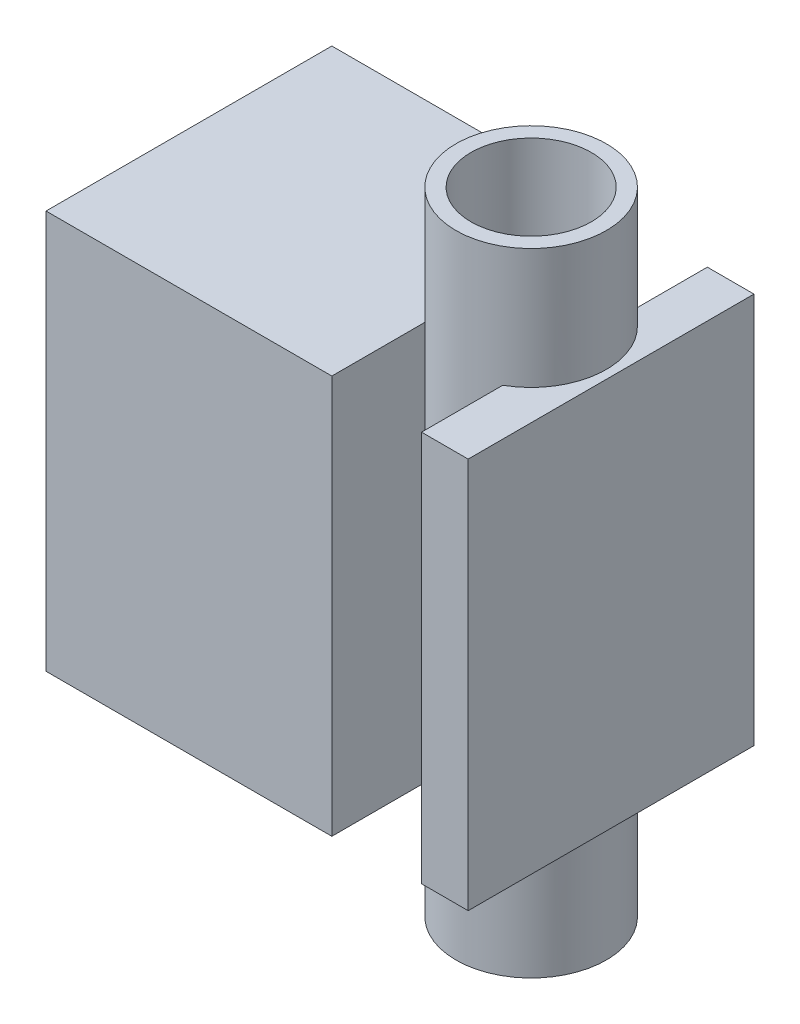
ISO-10303-21;
HEADER;
FILE_DESCRIPTION(('STEP AP214'),'2;1');
FILE_NAME('part.step','',(''),(''),'','','');
FILE_SCHEMA(('AUTOMOTIVE_DESIGN { 1 0 10303 214 1 1 1 1 }'));
ENDSEC;
DATA;
#1=APPLICATION_CONTEXT('core data for automotive mechanical design processes');
#2=APPLICATION_PROTOCOL_DEFINITION('international standard','automotive_design',2000,#1);
#3=PRODUCT_CONTEXT('',#1,'mechanical');
#4=PRODUCT('Part','Part','',(#3));
#5=PRODUCT_RELATED_PRODUCT_CATEGORY('part','',(#4));
#6=PRODUCT_DEFINITION_FORMATION('','',#4);
#7=PRODUCT_DEFINITION_CONTEXT('part definition',#1,'design');
#8=PRODUCT_DEFINITION('design','',#6,#7);
#9=PRODUCT_DEFINITION_SHAPE('','',#8);
#10=(LENGTH_UNIT() NAMED_UNIT(*) SI_UNIT(.MILLI.,.METRE.));
#11=(NAMED_UNIT(*) PLANE_ANGLE_UNIT() SI_UNIT($,.RADIAN.));
#12=(NAMED_UNIT(*) SI_UNIT($,.STERADIAN.) SOLID_ANGLE_UNIT());
#13=UNCERTAINTY_MEASURE_WITH_UNIT(LENGTH_MEASURE(1.E-05),#10,'distance_accuracy_value','');
#14=(GEOMETRIC_REPRESENTATION_CONTEXT(3) GLOBAL_UNCERTAINTY_ASSIGNED_CONTEXT((#13)) GLOBAL_UNIT_ASSIGNED_CONTEXT((#10,
#11,#12)) REPRESENTATION_CONTEXT('',''));
#15=CARTESIAN_POINT('',(0.,0.,0.));
#16=DIRECTION('',(0.,0.,1.));
#17=DIRECTION('',(1.,0.,0.));
#18=AXIS2_PLACEMENT_3D('',#15,#16,#17);
#19=CARTESIAN_POINT('',(-62.7768595041322,-38.9338842975206,18.5));
#20=DIRECTION('',(0.,1.,0.));
#21=DIRECTION('',(0.,0.,1.));
#22=AXIS2_PLACEMENT_3D('',#19,#20,#21);
#23=CYLINDRICAL_SURFACE('',#22,10.);
#24=CARTESIAN_POINT('',(-62.7768595041322,29.5661157024794,18.5));
#25=DIRECTION('',(0.,-1.,0.));
#26=DIRECTION('',(0.,0.,-1.));
#27=AXIS2_PLACEMENT_3D('',#24,#25,#26);
#28=CIRCLE('',#27,10.);
#29=CARTESIAN_POINT('',(-69.7768595041322,29.5661157024794,25.6414284285429));
#30=VERTEX_POINT('',#29);
#31=CARTESIAN_POINT('',(-69.7768595041322,29.5661157024794,11.3585715714572));
#32=VERTEX_POINT('',#31);
#33=EDGE_CURVE('E11',#30,#32,#28,.T.);
#34=ORIENTED_EDGE('',*,*,#33,.F.);
#35=DIRECTION('',(0.,1.,0.));
#36=VECTOR('',#35,1.);
#37=CARTESIAN_POINT('',(-69.7768595041322,-38.9338842975206,25.6414284285429));
#38=LINE('',#37,#36);
#39=CARTESIAN_POINT('',(-69.7768595041322,-23.4338842975206,25.6414284285429));
#40=VERTEX_POINT('',#39);
#41=EDGE_CURVE('E182',#40,#30,#38,.T.);
#42=ORIENTED_EDGE('',*,*,#41,.F.);
#43=CARTESIAN_POINT('',(-62.7768595041322,-23.4338842975206,18.5));
#44=DIRECTION('',(0.,1.,0.));
#45=DIRECTION('',(0.,0.,1.));
#46=AXIS2_PLACEMENT_3D('',#43,#44,#45);
#47=CIRCLE('',#46,10.);
#48=CARTESIAN_POINT('',(-69.7768595041322,-23.4338842975206,11.3585715714572));
#49=VERTEX_POINT('',#48);
#50=EDGE_CURVE('E198',#49,#40,#47,.T.);
#51=ORIENTED_EDGE('',*,*,#50,.F.);
#52=DIRECTION('',(0.,1.,0.));
#53=VECTOR('',#52,1.);
#54=CARTESIAN_POINT('',(-69.7768595041322,-38.9338842975206,11.3585715714572));
#55=LINE('',#54,#53);
#56=EDGE_CURVE('E184',#49,#32,#55,.T.);
#57=ORIENTED_EDGE('',*,*,#56,.T.);
#58=EDGE_LOOP('',(#34,#42,#51,#57));
#59=FACE_BOUND('',#58,.T.);
#60=CARTESIAN_POINT('',(-62.7768595041322,-38.9338842975206,18.5));
#61=DIRECTION('',(0.,1.,0.));
#62=DIRECTION('',(0.,0.,1.));
#63=AXIS2_PLACEMENT_3D('',#60,#61,#62);
#64=CIRCLE('',#63,10.);
#65=CARTESIAN_POINT('',(-62.7768595041322,-38.9338842975206,28.5));
#66=VERTEX_POINT('',#65);
#67=EDGE_CURVE('E195',#66,#66,#64,.T.);
#68=ORIENTED_EDGE('',*,*,#67,.T.);
#69=EDGE_LOOP('',(#68));
#70=FACE_BOUND('',#69,.T.);
#71=CARTESIAN_POINT('',(-62.7768595041322,45.0661157024794,18.5));
#72=DIRECTION('',(0.,1.,0.));
#73=DIRECTION('',(0.,0.,1.));
#74=AXIS2_PLACEMENT_3D('',#71,#72,#73);
#75=CIRCLE('',#74,10.);
#76=CARTESIAN_POINT('',(-62.7768595041322,45.0661157024794,28.5));
#77=VERTEX_POINT('',#76);
#78=EDGE_CURVE('E39',#77,#77,#75,.T.);
#79=ORIENTED_EDGE('',*,*,#78,.F.);
#80=EDGE_LOOP('',(#79));
#81=FACE_BOUND('',#80,.T.);
#82=DIRECTION('',(0.,1.,0.));
#83=VECTOR('',#82,1.);
#84=CARTESIAN_POINT('',(-57.8500113922823,-38.9338842975206,9.79792164579283));
#85=LINE('',#84,#83);
#86=CARTESIAN_POINT('',(-57.8500113922823,-22.9338842975206,9.79792164579283));
#87=VERTEX_POINT('',#86);
#88=CARTESIAN_POINT('',(-57.8500113922823,29.0661157024794,9.79792164579283));
#89=VERTEX_POINT('',#88);
#90=EDGE_CURVE('E57',#87,#89,#85,.T.);
#91=ORIENTED_EDGE('',*,*,#90,.F.);
#92=CARTESIAN_POINT('',(-62.7768595041322,-22.9338842975206,18.5));
#93=DIRECTION('',(0.,1.,0.));
#94=DIRECTION('',(0.,0.,1.));
#95=AXIS2_PLACEMENT_3D('',#92,#93,#94);
#96=CIRCLE('',#95,10.);
#97=CARTESIAN_POINT('',(-57.8500113922823,-22.9338842975206,27.2020783542072));
#98=VERTEX_POINT('',#97);
#99=EDGE_CURVE('E52',#87,#98,#96,.F.);
#100=ORIENTED_EDGE('',*,*,#99,.T.);
#101=DIRECTION('',(0.,1.,0.));
#102=VECTOR('',#101,1.);
#103=CARTESIAN_POINT('',(-57.8500113922823,-38.9338842975206,27.2020783542072));
#104=LINE('',#103,#102);
#105=CARTESIAN_POINT('',(-57.8500113922823,29.0661157024794,27.2020783542072));
#106=VERTEX_POINT('',#105);
#107=EDGE_CURVE('E175',#106,#98,#104,.F.);
#108=ORIENTED_EDGE('',*,*,#107,.F.);
#109=CARTESIAN_POINT('',(-62.7768595041322,29.0661157024794,18.5));
#110=DIRECTION('',(0.,1.,0.));
#111=DIRECTION('',(0.,0.,1.));
#112=AXIS2_PLACEMENT_3D('',#109,#110,#111);
#113=CIRCLE('',#112,10.);
#114=EDGE_CURVE('E166',#89,#106,#113,.F.);
#115=ORIENTED_EDGE('',*,*,#114,.F.);
#116=EDGE_LOOP('',(#91,#100,#108,#115));
#117=FACE_BOUND('',#116,.T.);
#118=ADVANCED_FACE('F35',(#59,#70,#81,#117),#23,.T.);
#119=CARTESIAN_POINT('',(-107.776859504132,29.5661157024794,38.));
#120=DIRECTION('',(1.,0.,0.));
#121=DIRECTION('',(0.,1.,0.));
#122=AXIS2_PLACEMENT_3D('',#119,#120,#121);
#123=PLANE('',#122);
#124=DIRECTION('',(0.,-1.,0.));
#125=VECTOR('',#124,1.);
#126=CARTESIAN_POINT('',(-107.776859504132,29.5661157024794,0.));
#127=LINE('',#126,#125);
#128=CARTESIAN_POINT('',(-107.776859504132,29.5661157024794,0.));
#129=VERTEX_POINT('',#128);
#130=CARTESIAN_POINT('',(-107.776859504132,-23.4338842975206,0.));
#131=VERTEX_POINT('',#130);
#132=EDGE_CURVE('E201',#129,#131,#127,.T.);
#133=ORIENTED_EDGE('',*,*,#132,.T.);
#134=DIRECTION('',(0.,0.,-1.));
#135=VECTOR('',#134,1.);
#136=CARTESIAN_POINT('',(-107.776859504132,-23.4338842975206,38.));
#137=LINE('',#136,#135);
#138=CARTESIAN_POINT('',(-107.776859504132,-23.4338842975206,38.));
#139=VERTEX_POINT('',#138);
#140=EDGE_CURVE('E44',#139,#131,#137,.T.);
#141=ORIENTED_EDGE('',*,*,#140,.F.);
#142=DIRECTION('',(0.,-1.,0.));
#143=VECTOR('',#142,1.);
#144=CARTESIAN_POINT('',(-107.776859504132,29.5661157024794,38.));
#145=LINE('',#144,#143);
#146=CARTESIAN_POINT('',(-107.776859504132,29.5661157024794,38.));
#147=VERTEX_POINT('',#146);
#148=EDGE_CURVE('E202',#147,#139,#145,.T.);
#149=ORIENTED_EDGE('',*,*,#148,.F.);
#150=DIRECTION('',(0.,0.,-1.));
#151=VECTOR('',#150,1.);
#152=CARTESIAN_POINT('',(-107.776859504132,29.5661157024794,38.));
#153=LINE('',#152,#151);
#154=EDGE_CURVE('E211',#147,#129,#153,.T.);
#155=ORIENTED_EDGE('',*,*,#154,.T.);
#156=EDGE_LOOP('',(#133,#141,#149,#155));
#157=FACE_BOUND('',#156,.T.);
#158=ADVANCED_FACE('F37',(#157),#123,.F.);
#159=CARTESIAN_POINT('',(-107.776859504132,-23.4338842975206,38.));
#160=DIRECTION('',(0.,1.,0.));
#161=DIRECTION('',(0.,0.,1.));
#162=AXIS2_PLACEMENT_3D('',#159,#160,#161);
#163=PLANE('',#162);
#164=DIRECTION('',(0.,0.,-1.));
#165=VECTOR('',#164,1.);
#166=CARTESIAN_POINT('',(-69.7768595041322,-23.4338842975206,38.));
#167=LINE('',#166,#165);
#168=CARTESIAN_POINT('',(-69.7768595041322,-23.4338842975206,0.));
#169=VERTEX_POINT('',#168);
#170=EDGE_CURVE('E224',#49,#169,#167,.T.);
#171=ORIENTED_EDGE('',*,*,#170,.F.);
#172=ORIENTED_EDGE('',*,*,#50,.T.);
#173=CARTESIAN_POINT('',(-69.7768595041322,-23.4338842975206,38.));
#174=VERTEX_POINT('',#173);
#175=EDGE_CURVE('E225',#174,#40,#167,.T.);
#176=ORIENTED_EDGE('',*,*,#175,.F.);
#177=DIRECTION('',(1.,0.,0.));
#178=VECTOR('',#177,1.);
#179=CARTESIAN_POINT('',(-107.776859504132,-23.4338842975206,38.));
#180=LINE('',#179,#178);
#181=EDGE_CURVE('E205',#139,#174,#180,.T.);
#182=ORIENTED_EDGE('',*,*,#181,.F.);
#183=ORIENTED_EDGE('',*,*,#140,.T.);
#184=DIRECTION('',(1.,0.,0.));
#185=VECTOR('',#184,1.);
#186=CARTESIAN_POINT('',(-107.776859504132,-23.4338842975206,0.));
#187=LINE('',#186,#185);
#188=EDGE_CURVE('E214',#131,#169,#187,.T.);
#189=ORIENTED_EDGE('',*,*,#188,.T.);
#190=EDGE_LOOP('',(#171,#172,#176,#182,#183,#189));
#191=FACE_BOUND('',#190,.T.);
#192=ADVANCED_FACE('F242',(#191),#163,.F.);
#193=CARTESIAN_POINT('',(-49.7768595041322,-38.9338842975206,38.));
#194=DIRECTION('',(0.,1.,0.));
#195=DIRECTION('',(0.,0.,1.));
#196=AXIS2_PLACEMENT_3D('',#193,#194,#195);
#197=PLANE('',#196);
#198=CARTESIAN_POINT('',(-62.7768595041322,-38.9338842975206,18.5));
#199=DIRECTION('',(0.,1.,0.));
#200=DIRECTION('',(0.,0.,1.));
#201=AXIS2_PLACEMENT_3D('',#198,#199,#200);
#202=CIRCLE('',#201,8.);
#203=CARTESIAN_POINT('',(-62.7768595041322,-38.9338842975206,26.5));
#204=VERTEX_POINT('',#203);
#205=EDGE_CURVE('E181',#204,#204,#202,.T.);
#206=ORIENTED_EDGE('',*,*,#205,.T.);
#207=EDGE_LOOP('',(#206));
#208=FACE_BOUND('',#207,.T.);
#209=ORIENTED_EDGE('',*,*,#67,.F.);
#210=EDGE_LOOP('',(#209));
#211=FACE_BOUND('',#210,.T.);
#212=ADVANCED_FACE('F264',(#208,#211),#197,.F.);
#213=CARTESIAN_POINT('',(-49.7768595041322,45.0661157024794,38.));
#214=DIRECTION('',(0.,-1.,0.));
#215=DIRECTION('',(0.,0.,-1.));
#216=AXIS2_PLACEMENT_3D('',#213,#214,#215);
#217=PLANE('',#216);
#218=CARTESIAN_POINT('',(-62.7768595041322,45.0661157024794,18.5));
#219=DIRECTION('',(0.,-1.,0.));
#220=DIRECTION('',(0.,0.,-1.));
#221=AXIS2_PLACEMENT_3D('',#218,#219,#220);
#222=CIRCLE('',#221,8.);
#223=CARTESIAN_POINT('',(-62.7768595041322,45.0661157024794,26.5));
#224=VERTEX_POINT('',#223);
#225=EDGE_CURVE('E194',#224,#224,#222,.T.);
#226=ORIENTED_EDGE('',*,*,#225,.T.);
#227=EDGE_LOOP('',(#226));
#228=FACE_BOUND('',#227,.T.);
#229=ORIENTED_EDGE('',*,*,#78,.T.);
#230=EDGE_LOOP('',(#229));
#231=FACE_BOUND('',#230,.T.);
#232=ADVANCED_FACE('F234',(#228,#231),#217,.F.);
#233=CARTESIAN_POINT('',(-107.776859504132,29.5661157024794,38.));
#234=DIRECTION('',(0.,-1.,0.));
#235=DIRECTION('',(0.,0.,-1.));
#236=AXIS2_PLACEMENT_3D('',#233,#234,#235);
#237=PLANE('',#236);
#238=DIRECTION('',(0.,0.,-1.));
#239=VECTOR('',#238,1.);
#240=CARTESIAN_POINT('',(-69.7768595041322,29.5661157024794,38.));
#241=LINE('',#240,#239);
#242=CARTESIAN_POINT('',(-69.7768595041322,29.5661157024794,38.));
#243=VERTEX_POINT('',#242);
#244=EDGE_CURVE('E221',#243,#30,#241,.T.);
#245=ORIENTED_EDGE('',*,*,#244,.T.);
#246=ORIENTED_EDGE('',*,*,#33,.T.);
#247=CARTESIAN_POINT('',(-69.7768595041322,29.5661157024794,0.));
#248=VERTEX_POINT('',#247);
#249=EDGE_CURVE('E220',#32,#248,#241,.T.);
#250=ORIENTED_EDGE('',*,*,#249,.T.);
#251=DIRECTION('',(-1.,0.,0.));
#252=VECTOR('',#251,1.);
#253=CARTESIAN_POINT('',(-107.776859504132,29.5661157024794,0.));
#254=LINE('',#253,#252);
#255=EDGE_CURVE('E206',#248,#129,#254,.T.);
#256=ORIENTED_EDGE('',*,*,#255,.T.);
#257=ORIENTED_EDGE('',*,*,#154,.F.);
#258=DIRECTION('',(-1.,0.,0.));
#259=VECTOR('',#258,1.);
#260=CARTESIAN_POINT('',(-107.776859504132,29.5661157024794,38.));
#261=LINE('',#260,#259);
#262=EDGE_CURVE('E209',#243,#147,#261,.T.);
#263=ORIENTED_EDGE('',*,*,#262,.F.);
#264=EDGE_LOOP('',(#245,#246,#250,#256,#257,#263));
#265=FACE_BOUND('',#264,.T.);
#266=ADVANCED_FACE('F254',(#265),#237,.F.);
#267=CARTESIAN_POINT('',(0.,0.,38.));
#268=DIRECTION('',(0.,0.,1.));
#269=DIRECTION('',(1.,0.,0.));
#270=AXIS2_PLACEMENT_3D('',#267,#268,#269);
#271=PLANE('',#270);
#272=DIRECTION('',(0.,1.,0.));
#273=VECTOR('',#272,1.);
#274=CARTESIAN_POINT('',(-69.7768595041322,-38.9338842975206,38.));
#275=LINE('',#274,#273);
#276=EDGE_CURVE('E178',#174,#243,#275,.T.);
#277=ORIENTED_EDGE('',*,*,#276,.T.);
#278=ORIENTED_EDGE('',*,*,#262,.T.);
#279=ORIENTED_EDGE('',*,*,#148,.T.);
#280=ORIENTED_EDGE('',*,*,#181,.T.);
#281=EDGE_LOOP('',(#277,#278,#279,#280));
#282=FACE_BOUND('',#281,.T.);
#283=ADVANCED_FACE('F250',(#282),#271,.T.);
#284=CARTESIAN_POINT('',(0.,0.,0.));
#285=DIRECTION('',(0.,0.,1.));
#286=DIRECTION('',(1.,0.,0.));
#287=AXIS2_PLACEMENT_3D('',#284,#285,#286);
#288=PLANE('',#287);
#289=ORIENTED_EDGE('',*,*,#255,.F.);
#290=DIRECTION('',(0.,1.,0.));
#291=VECTOR('',#290,1.);
#292=CARTESIAN_POINT('',(-69.7768595041322,-38.9338842975206,0.));
#293=LINE('',#292,#291);
#294=EDGE_CURVE('E177',#169,#248,#293,.T.);
#295=ORIENTED_EDGE('',*,*,#294,.F.);
#296=ORIENTED_EDGE('',*,*,#188,.F.);
#297=ORIENTED_EDGE('',*,*,#132,.F.);
#298=EDGE_LOOP('',(#289,#295,#296,#297));
#299=FACE_BOUND('',#298,.T.);
#300=ADVANCED_FACE('F253',(#299),#288,.F.);
#301=CARTESIAN_POINT('',(-62.7768595041322,-38.9338842975206,18.5));
#302=DIRECTION('',(0.,1.,0.));
#303=DIRECTION('',(0.,0.,1.));
#304=AXIS2_PLACEMENT_3D('',#301,#302,#303);
#305=CYLINDRICAL_SURFACE('',#304,8.);
#306=CARTESIAN_POINT('',(-62.7768595041322,45.0661157024794,26.5));
#307=CARTESIAN_POINT('',(-62.7768595041322,44.1911157024794,26.5));
#308=CARTESIAN_POINT('',(-62.7768595041322,43.3161157024794,26.5));
#309=CARTESIAN_POINT('',(-62.7768595041322,41.5661157024794,26.5));
#310=CARTESIAN_POINT('',(-62.7768595041322,40.6911157024794,26.5));
#311=CARTESIAN_POINT('',(-62.7768595041322,38.9411157024794,26.5));
#312=CARTESIAN_POINT('',(-62.7768595041322,38.0661157024794,26.5));
#313=CARTESIAN_POINT('',(-62.7768595041322,36.3161157024794,26.5));
#314=CARTESIAN_POINT('',(-62.7768595041322,35.4411157024794,26.5));
#315=CARTESIAN_POINT('',(-62.7768595041322,33.6911157024794,26.5));
#316=CARTESIAN_POINT('',(-62.7768595041322,32.8161157024794,26.5));
#317=CARTESIAN_POINT('',(-62.7768595041322,31.0661157024794,26.5));
#318=CARTESIAN_POINT('',(-62.7768595041322,30.1911157024794,26.5));
#319=CARTESIAN_POINT('',(-62.7768595041322,28.4411157024794,26.5));
#320=CARTESIAN_POINT('',(-62.7768595041322,27.5661157024794,26.5));
#321=CARTESIAN_POINT('',(-62.7768595041322,25.8161157024794,26.5));
#322=CARTESIAN_POINT('',(-62.7768595041322,24.9411157024794,26.5));
#323=CARTESIAN_POINT('',(-62.7768595041322,23.1911157024794,26.5));
#324=CARTESIAN_POINT('',(-62.7768595041322,22.3161157024794,26.5));
#325=CARTESIAN_POINT('',(-62.7768595041322,20.5661157024794,26.5));
#326=CARTESIAN_POINT('',(-62.7768595041322,19.6911157024794,26.5));
#327=CARTESIAN_POINT('',(-62.7768595041322,17.9411157024794,26.5));
#328=CARTESIAN_POINT('',(-62.7768595041322,17.0661157024794,26.5));
#329=CARTESIAN_POINT('',(-62.7768595041322,15.3161157024794,26.5));
#330=CARTESIAN_POINT('',(-62.7768595041322,14.4411157024794,26.5));
#331=CARTESIAN_POINT('',(-62.7768595041322,12.6911157024794,26.5));
#332=CARTESIAN_POINT('',(-62.7768595041322,11.8161157024794,26.5));
#333=CARTESIAN_POINT('',(-62.7768595041322,10.0661157024794,26.5));
#334=CARTESIAN_POINT('',(-62.7768595041322,9.19111570247938,26.5));
#335=CARTESIAN_POINT('',(-62.7768595041322,7.44111570247938,26.5));
#336=CARTESIAN_POINT('',(-62.7768595041322,6.56611570247938,26.5));
#337=CARTESIAN_POINT('',(-62.7768595041322,4.81611570247938,26.5));
#338=CARTESIAN_POINT('',(-62.7768595041322,3.94111570247938,26.5));
#339=CARTESIAN_POINT('',(-62.7768595041322,2.19111570247937,26.5));
#340=CARTESIAN_POINT('',(-62.7768595041322,1.31611570247937,26.5));
#341=CARTESIAN_POINT('',(-62.7768595041322,-0.433884297520629,26.5));
#342=CARTESIAN_POINT('',(-62.7768595041322,-1.30888429752063,26.5));
#343=CARTESIAN_POINT('',(-62.7768595041322,-3.05888429752063,26.5));
#344=CARTESIAN_POINT('',(-62.7768595041322,-3.93388429752063,26.5));
#345=CARTESIAN_POINT('',(-62.7768595041322,-5.68388429752063,26.5));
#346=CARTESIAN_POINT('',(-62.7768595041322,-6.55888429752063,26.5));
#347=CARTESIAN_POINT('',(-62.7768595041322,-8.30888429752063,26.5));
#348=CARTESIAN_POINT('',(-62.7768595041322,-9.18388429752063,26.5));
#349=CARTESIAN_POINT('',(-62.7768595041322,-10.9338842975206,26.5));
#350=CARTESIAN_POINT('',(-62.7768595041322,-11.8088842975206,26.5));
#351=CARTESIAN_POINT('',(-62.7768595041322,-13.5588842975206,26.5));
#352=CARTESIAN_POINT('',(-62.7768595041322,-14.4338842975206,26.5));
#353=CARTESIAN_POINT('',(-62.7768595041322,-16.1838842975206,26.5));
#354=CARTESIAN_POINT('',(-62.7768595041322,-17.0588842975206,26.5));
#355=CARTESIAN_POINT('',(-62.7768595041322,-18.8088842975206,26.5));
#356=CARTESIAN_POINT('',(-62.7768595041322,-19.6838842975206,26.5));
#357=CARTESIAN_POINT('',(-62.7768595041322,-21.4338842975206,26.5));
#358=CARTESIAN_POINT('',(-62.7768595041322,-22.3088842975206,26.5));
#359=CARTESIAN_POINT('',(-62.7768595041322,-24.0588842975206,26.5));
#360=CARTESIAN_POINT('',(-62.7768595041322,-24.9338842975206,26.5));
#361=CARTESIAN_POINT('',(-62.7768595041322,-26.6838842975206,26.5));
#362=CARTESIAN_POINT('',(-62.7768595041322,-27.5588842975206,26.5));
#363=CARTESIAN_POINT('',(-62.7768595041322,-29.3088842975206,26.5));
#364=CARTESIAN_POINT('',(-62.7768595041322,-30.1838842975206,26.5));
#365=CARTESIAN_POINT('',(-62.7768595041322,-31.9338842975206,26.5));
#366=CARTESIAN_POINT('',(-62.7768595041322,-32.8088842975206,26.5));
#367=CARTESIAN_POINT('',(-62.7768595041322,-34.5588842975206,26.5));
#368=CARTESIAN_POINT('',(-62.7768595041322,-35.4338842975206,26.5));
#369=CARTESIAN_POINT('',(-62.7768595041322,-37.1838842975206,26.5));
#370=CARTESIAN_POINT('',(-62.7768595041322,-38.0588842975206,26.5));
#371=CARTESIAN_POINT('',(-62.7768595041322,-38.9338842975206,26.5));
#372=B_SPLINE_CURVE_WITH_KNOTS('',3,(#306,#307,#308,#309,#310,#311,#312,#313,#314,#315,#316,
#317,#318,#319,#320,#321,#322,#323,#324,#325,#326,#327,#328,#329,#330,#331,#332,#333,#334,#335,
#336,#337,#338,#339,#340,#341,#342,#343,#344,#345,#346,#347,#348,#349,#350,#351,#352,#353,#354,
#355,#356,#357,#358,#359,#360,#361,#362,#363,#364,#365,#366,#367,#368,#369,#370,#371),
.UNSPECIFIED.,.F.,.F.,(4,2,2,2,2,2,2,2,2,2,2,2,2,2,2,2,2,2,2,2,2,2,2,2,2,2,2,2,2,2,2,2,4),(0.,
2.625,5.25,7.87500000000001,10.5,13.125,15.75,18.375,21.,23.625,26.25,28.875,31.5,34.125,36.75,
39.375,42.,44.625,47.25,49.875,52.5,55.125,57.75,60.375,63.,65.625,68.25,70.875,73.5,76.125,
78.75,81.375,84.),.UNSPECIFIED.);
#373=EDGE_CURVE('BSEAM248',#224,#204,#372,.T.);
#374=ORIENTED_EDGE('',*,*,#225,.F.);
#375=ORIENTED_EDGE('',*,*,#205,.F.);
#376=ORIENTED_EDGE('',*,*,#373,.T.);
#377=ORIENTED_EDGE('',*,*,#373,.F.);
#378=EDGE_LOOP('',(#374,#376,#375,#377));
#379=FACE_BOUND('',#378,.T.);
#380=ADVANCED_FACE('F248',(#379),#305,.F.);
#381=CARTESIAN_POINT('',(-69.7768595041322,-38.9338842975206,25.6414284285429));
#382=DIRECTION('',(-1.,0.,0.));
#383=DIRECTION('',(0.,0.,1.));
#384=AXIS2_PLACEMENT_3D('',#381,#382,#383);
#385=PLANE('',#384);
#386=ORIENTED_EDGE('',*,*,#41,.T.);
#387=ORIENTED_EDGE('',*,*,#244,.F.);
#388=ORIENTED_EDGE('',*,*,#276,.F.);
#389=ORIENTED_EDGE('',*,*,#175,.T.);
#390=EDGE_LOOP('',(#386,#387,#388,#389));
#391=FACE_BOUND('',#390,.T.);
#392=ADVANCED_FACE('F285',(#391),#385,.F.);
#393=CARTESIAN_POINT('',(-69.7768595041322,-38.9338842975206,0.));
#394=DIRECTION('',(-1.,0.,0.));
#395=DIRECTION('',(0.,0.,1.));
#396=AXIS2_PLACEMENT_3D('',#393,#394,#395);
#397=PLANE('',#396);
#398=ORIENTED_EDGE('',*,*,#294,.T.);
#399=ORIENTED_EDGE('',*,*,#249,.F.);
#400=ORIENTED_EDGE('',*,*,#56,.F.);
#401=ORIENTED_EDGE('',*,*,#170,.T.);
#402=EDGE_LOOP('',(#398,#399,#400,#401));
#403=FACE_BOUND('',#402,.T.);
#404=ADVANCED_FACE('F276',(#403),#397,.F.);
#405=CARTESIAN_POINT('',(-51.6509926690898,-22.9338842975206,0.));
#406=DIRECTION('',(1.,0.,0.));
#407=DIRECTION('',(0.,0.,-1.));
#408=AXIS2_PLACEMENT_3D('',#405,#406,#407);
#409=PLANE('',#408);
#410=DIRECTION('',(0.,0.,-1.));
#411=VECTOR('',#410,1.);
#412=CARTESIAN_POINT('',(-51.6509926690898,29.0661157024794,0.));
#413=LINE('',#412,#411);
#414=CARTESIAN_POINT('',(-51.6509926690898,29.0661157024794,38.));
#415=VERTEX_POINT('',#414);
#416=CARTESIAN_POINT('',(-51.6509926690898,29.0661157024794,0.));
#417=VERTEX_POINT('',#416);
#418=EDGE_CURVE('E135',#415,#417,#413,.T.);
#419=ORIENTED_EDGE('',*,*,#418,.F.);
#420=DIRECTION('',(0.,1.,0.));
#421=VECTOR('',#420,1.);
#422=CARTESIAN_POINT('',(-51.6509926690898,-22.9338842975206,38.));
#423=LINE('',#422,#421);
#424=CARTESIAN_POINT('',(-51.6509926690898,-22.9338842975206,38.));
#425=VERTEX_POINT('',#424);
#426=EDGE_CURVE('E167',#425,#415,#423,.T.);
#427=ORIENTED_EDGE('',*,*,#426,.F.);
#428=DIRECTION('',(0.,0.,-1.));
#429=VECTOR('',#428,1.);
#430=CARTESIAN_POINT('',(-51.6509926690898,-22.9338842975206,0.));
#431=LINE('',#430,#429);
#432=CARTESIAN_POINT('',(-51.6509926690898,-22.9338842975206,0.));
#433=VERTEX_POINT('',#432);
#434=EDGE_CURVE('E144',#425,#433,#431,.T.);
#435=ORIENTED_EDGE('',*,*,#434,.T.);
#436=DIRECTION('',(0.,1.,0.));
#437=VECTOR('',#436,1.);
#438=CARTESIAN_POINT('',(-51.6509926690898,-22.9338842975206,0.));
#439=LINE('',#438,#437);
#440=EDGE_CURVE('E129',#433,#417,#439,.T.);
#441=ORIENTED_EDGE('',*,*,#440,.T.);
#442=EDGE_LOOP('',(#419,#427,#435,#441));
#443=FACE_BOUND('',#442,.T.);
#444=ADVANCED_FACE('F293',(#443),#409,.T.);
#445=CARTESIAN_POINT('',(-51.6509926690898,-22.9338842975206,38.));
#446=DIRECTION('',(0.,0.,1.));
#447=DIRECTION('',(1.,0.,0.));
#448=AXIS2_PLACEMENT_3D('',#445,#446,#447);
#449=PLANE('',#448);
#450=DIRECTION('',(1.,0.,0.));
#451=VECTOR('',#450,1.);
#452=CARTESIAN_POINT('',(-51.6509926690898,29.0661157024794,38.));
#453=LINE('',#452,#451);
#454=CARTESIAN_POINT('',(-57.8500113922823,29.0661157024794,38.));
#455=VERTEX_POINT('',#454);
#456=EDGE_CURVE('E160',#455,#415,#453,.T.);
#457=ORIENTED_EDGE('',*,*,#456,.F.);
#458=DIRECTION('',(0.,1.,0.));
#459=VECTOR('',#458,1.);
#460=CARTESIAN_POINT('',(-57.8500113922823,-22.9338842975206,38.));
#461=LINE('',#460,#459);
#462=CARTESIAN_POINT('',(-57.8500113922823,-22.9338842975206,38.));
#463=VERTEX_POINT('',#462);
#464=EDGE_CURVE('E143',#463,#455,#461,.T.);
#465=ORIENTED_EDGE('',*,*,#464,.F.);
#466=DIRECTION('',(1.,0.,0.));
#467=VECTOR('',#466,1.);
#468=CARTESIAN_POINT('',(-52.7857057525386,-22.9338842975206,38.));
#469=LINE('',#468,#467);
#470=EDGE_CURVE('E150',#463,#425,#469,.T.);
#471=ORIENTED_EDGE('',*,*,#470,.T.);
#472=ORIENTED_EDGE('',*,*,#426,.T.);
#473=EDGE_LOOP('',(#457,#465,#471,#472));
#474=FACE_BOUND('',#473,.T.);
#475=ADVANCED_FACE('F303',(#474),#449,.T.);
#476=CARTESIAN_POINT('',(-57.8500113922823,-22.9338842975206,24.8028697973829));
#477=DIRECTION('',(-1.,0.,0.));
#478=DIRECTION('',(0.,0.,1.));
#479=AXIS2_PLACEMENT_3D('',#476,#477,#478);
#480=PLANE('',#479);
#481=DIRECTION('',(0.,0.,1.));
#482=VECTOR('',#481,1.);
#483=CARTESIAN_POINT('',(-57.8500113922823,29.0661157024794,24.8028697973829));
#484=LINE('',#483,#482);
#485=EDGE_CURVE('E158',#106,#455,#484,.T.);
#486=ORIENTED_EDGE('',*,*,#485,.F.);
#487=ORIENTED_EDGE('',*,*,#107,.T.);
#488=DIRECTION('',(0.,0.,1.));
#489=VECTOR('',#488,1.);
#490=CARTESIAN_POINT('',(-57.8500113922823,-22.9338842975206,24.8028697973829));
#491=LINE('',#490,#489);
#492=EDGE_CURVE('E148',#98,#463,#491,.T.);
#493=ORIENTED_EDGE('',*,*,#492,.T.);
#494=ORIENTED_EDGE('',*,*,#464,.T.);
#495=EDGE_LOOP('',(#486,#487,#493,#494));
#496=FACE_BOUND('',#495,.T.);
#497=ADVANCED_FACE('F300',(#496),#480,.T.);
#498=CARTESIAN_POINT('',(-57.8500113922823,-22.9338842975206,0.));
#499=DIRECTION('',(-1.,0.,0.));
#500=DIRECTION('',(0.,0.,1.));
#501=AXIS2_PLACEMENT_3D('',#498,#499,#500);
#502=PLANE('',#501);
#503=DIRECTION('',(0.,0.,1.));
#504=VECTOR('',#503,1.);
#505=CARTESIAN_POINT('',(-57.8500113922823,-22.9338842975206,0.));
#506=LINE('',#505,#504);
#507=CARTESIAN_POINT('',(-57.8500113922823,-22.9338842975206,0.));
#508=VERTEX_POINT('',#507);
#509=EDGE_CURVE('E134',#508,#87,#506,.T.);
#510=ORIENTED_EDGE('',*,*,#509,.T.);
#511=ORIENTED_EDGE('',*,*,#90,.T.);
#512=DIRECTION('',(0.,0.,1.));
#513=VECTOR('',#512,1.);
#514=CARTESIAN_POINT('',(-57.8500113922823,29.0661157024794,0.));
#515=LINE('',#514,#513);
#516=CARTESIAN_POINT('',(-57.8500113922823,29.0661157024794,0.));
#517=VERTEX_POINT('',#516);
#518=EDGE_CURVE('E141',#517,#89,#515,.T.);
#519=ORIENTED_EDGE('',*,*,#518,.F.);
#520=DIRECTION('',(0.,1.,0.));
#521=VECTOR('',#520,1.);
#522=CARTESIAN_POINT('',(-57.8500113922823,-22.9338842975206,0.));
#523=LINE('',#522,#521);
#524=EDGE_CURVE('E126',#508,#517,#523,.T.);
#525=ORIENTED_EDGE('',*,*,#524,.F.);
#526=EDGE_LOOP('',(#510,#511,#519,#525));
#527=FACE_BOUND('',#526,.T.);
#528=ADVANCED_FACE('F139',(#527),#502,.T.);
#529=CARTESIAN_POINT('',(-57.8500113922823,-22.9338842975206,0.));
#530=DIRECTION('',(0.,0.,-1.));
#531=DIRECTION('',(-1.,0.,0.));
#532=AXIS2_PLACEMENT_3D('',#529,#530,#531);
#533=PLANE('',#532);
#534=DIRECTION('',(-1.,0.,0.));
#535=VECTOR('',#534,1.);
#536=CARTESIAN_POINT('',(-57.8500113922823,29.0661157024794,0.));
#537=LINE('',#536,#535);
#538=EDGE_CURVE('E155',#417,#517,#537,.T.);
#539=ORIENTED_EDGE('',*,*,#538,.F.);
#540=ORIENTED_EDGE('',*,*,#440,.F.);
#541=DIRECTION('',(-1.,0.,0.));
#542=VECTOR('',#541,1.);
#543=CARTESIAN_POINT('',(-52.7857057525386,-22.9338842975206,0.));
#544=LINE('',#543,#542);
#545=EDGE_CURVE('E123',#433,#508,#544,.T.);
#546=ORIENTED_EDGE('',*,*,#545,.T.);
#547=ORIENTED_EDGE('',*,*,#524,.T.);
#548=EDGE_LOOP('',(#539,#540,#546,#547));
#549=FACE_BOUND('',#548,.T.);
#550=ADVANCED_FACE('F125',(#549),#533,.T.);
#551=CARTESIAN_POINT('',(-62.7768595041322,-22.9338842975206,18.5));
#552=DIRECTION('',(0.,1.,0.));
#553=DIRECTION('',(0.,0.,1.));
#554=AXIS2_PLACEMENT_3D('',#551,#552,#553);
#555=PLANE('',#554);
#556=ORIENTED_EDGE('',*,*,#99,.F.);
#557=ORIENTED_EDGE('',*,*,#509,.F.);
#558=ORIENTED_EDGE('',*,*,#545,.F.);
#559=ORIENTED_EDGE('',*,*,#434,.F.);
#560=ORIENTED_EDGE('',*,*,#470,.F.);
#561=ORIENTED_EDGE('',*,*,#492,.F.);
#562=EDGE_LOOP('',(#556,#557,#558,#559,#560,#561));
#563=FACE_BOUND('',#562,.T.);
#564=ADVANCED_FACE('F146',(#563),#555,.F.);
#565=CARTESIAN_POINT('',(-62.7768595041322,29.0661157024794,18.5));
#566=DIRECTION('',(0.,1.,0.));
#567=DIRECTION('',(0.,0.,1.));
#568=AXIS2_PLACEMENT_3D('',#565,#566,#567);
#569=PLANE('',#568);
#570=ORIENTED_EDGE('',*,*,#518,.T.);
#571=ORIENTED_EDGE('',*,*,#114,.T.);
#572=ORIENTED_EDGE('',*,*,#485,.T.);
#573=ORIENTED_EDGE('',*,*,#456,.T.);
#574=ORIENTED_EDGE('',*,*,#418,.T.);
#575=ORIENTED_EDGE('',*,*,#538,.T.);
#576=EDGE_LOOP('',(#570,#571,#572,#573,#574,#575));
#577=FACE_BOUND('',#576,.T.);
#578=ADVANCED_FACE('F311',(#577),#569,.T.);
#579=CLOSED_SHELL('',(#118,#158,#192,#212,#232,#266,#283,#300,#380,#392,#404,#444,#475,#497,
#528,#550,#564,#578));
#580=MANIFOLD_SOLID_BREP('B2',#579);
#581=ADVANCED_BREP_SHAPE_REPRESENTATION('',(#18,#580),#14);
#582=SHAPE_DEFINITION_REPRESENTATION(#9,#581);
ENDSEC;
END-ISO-10303-21;
